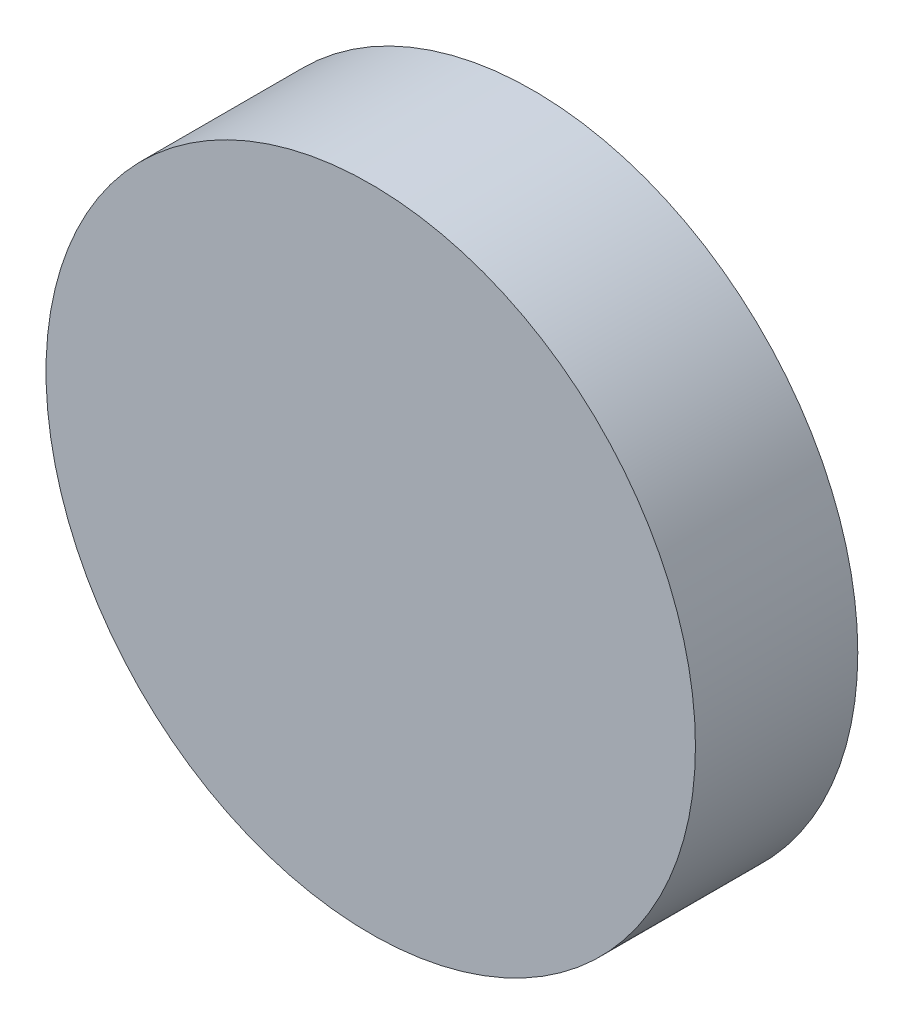
ISO-10303-21;
HEADER;
FILE_DESCRIPTION(('STEP AP214'),'2;1');
FILE_NAME('part.step','',(''),(''),'','','');
FILE_SCHEMA(('AUTOMOTIVE_DESIGN { 1 0 10303 214 1 1 1 1 }'));
ENDSEC;
DATA;
#1=APPLICATION_CONTEXT('core data for automotive mechanical design processes');
#2=APPLICATION_PROTOCOL_DEFINITION('international standard','automotive_design',2000,#1);
#3=PRODUCT_CONTEXT('',#1,'mechanical');
#4=PRODUCT('Part','Part','',(#3));
#5=PRODUCT_RELATED_PRODUCT_CATEGORY('part','',(#4));
#6=PRODUCT_DEFINITION_FORMATION('','',#4);
#7=PRODUCT_DEFINITION_CONTEXT('part definition',#1,'design');
#8=PRODUCT_DEFINITION('design','',#6,#7);
#9=PRODUCT_DEFINITION_SHAPE('','',#8);
#10=(LENGTH_UNIT() NAMED_UNIT(*) SI_UNIT(.MILLI.,.METRE.));
#11=(NAMED_UNIT(*) PLANE_ANGLE_UNIT() SI_UNIT($,.RADIAN.));
#12=(NAMED_UNIT(*) SI_UNIT($,.STERADIAN.) SOLID_ANGLE_UNIT());
#13=UNCERTAINTY_MEASURE_WITH_UNIT(LENGTH_MEASURE(1.E-05),#10,'distance_accuracy_value','');
#14=(GEOMETRIC_REPRESENTATION_CONTEXT(3) GLOBAL_UNCERTAINTY_ASSIGNED_CONTEXT((#13)) GLOBAL_UNIT_ASSIGNED_CONTEXT((#10,
#11,#12)) REPRESENTATION_CONTEXT('',''));
#15=CARTESIAN_POINT('',(0.,0.,0.));
#16=DIRECTION('',(0.,0.,1.));
#17=DIRECTION('',(1.,0.,0.));
#18=AXIS2_PLACEMENT_3D('',#15,#16,#17);
#19=CARTESIAN_POINT('',(0.,0.,1.));
#20=DIRECTION('',(0.,0.,-1.));
#21=DIRECTION('',(-1.,0.,0.));
#22=AXIS2_PLACEMENT_3D('',#19,#20,#21);
#23=CYLINDRICAL_SURFACE('',#22,2.);
#24=CARTESIAN_POINT('',(0.,0.,1.));
#25=DIRECTION('',(0.,0.,1.));
#26=DIRECTION('',(1.,0.,0.));
#27=AXIS2_PLACEMENT_3D('',#24,#25,#26);
#28=CIRCLE('',#27,2.);
#29=CARTESIAN_POINT('',(2.,0.,1.));
#30=VERTEX_POINT('',#29);
#31=EDGE_CURVE('E10',#30,#30,#28,.T.);
#32=ORIENTED_EDGE('',*,*,#31,.F.);
#33=EDGE_LOOP('',(#32));
#34=FACE_BOUND('',#33,.T.);
#35=CARTESIAN_POINT('',(0.,0.,0.));
#36=DIRECTION('',(0.,0.,1.));
#37=DIRECTION('',(1.,0.,0.));
#38=AXIS2_PLACEMENT_3D('',#35,#36,#37);
#39=CIRCLE('',#38,2.);
#40=CARTESIAN_POINT('',(2.,0.,0.));
#41=VERTEX_POINT('',#40);
#42=EDGE_CURVE('E33',#41,#41,#39,.T.);
#43=ORIENTED_EDGE('',*,*,#42,.T.);
#44=EDGE_LOOP('',(#43));
#45=FACE_BOUND('',#44,.T.);
#46=ADVANCED_FACE('F30',(#34,#45),#23,.T.);
#47=CARTESIAN_POINT('',(0.,0.,1.));
#48=DIRECTION('',(0.,0.,1.));
#49=DIRECTION('',(1.,0.,0.));
#50=AXIS2_PLACEMENT_3D('',#47,#48,#49);
#51=PLANE('',#50);
#52=ORIENTED_EDGE('',*,*,#31,.T.);
#53=EDGE_LOOP('',(#52));
#54=FACE_BOUND('',#53,.T.);
#55=ADVANCED_FACE('F45',(#54),#51,.T.);
#56=CARTESIAN_POINT('',(0.,0.,0.));
#57=DIRECTION('',(0.,0.,1.));
#58=DIRECTION('',(1.,0.,0.));
#59=AXIS2_PLACEMENT_3D('',#56,#57,#58);
#60=PLANE('',#59);
#61=ORIENTED_EDGE('',*,*,#42,.F.);
#62=EDGE_LOOP('',(#61));
#63=FACE_BOUND('',#62,.T.);
#64=ADVANCED_FACE('F43',(#63),#60,.F.);
#65=CLOSED_SHELL('',(#46,#55,#64));
#66=MANIFOLD_SOLID_BREP('B2',#65);
#67=ADVANCED_BREP_SHAPE_REPRESENTATION('',(#18,#66),#14);
#68=SHAPE_DEFINITION_REPRESENTATION(#9,#67);
ENDSEC;
END-ISO-10303-21;
